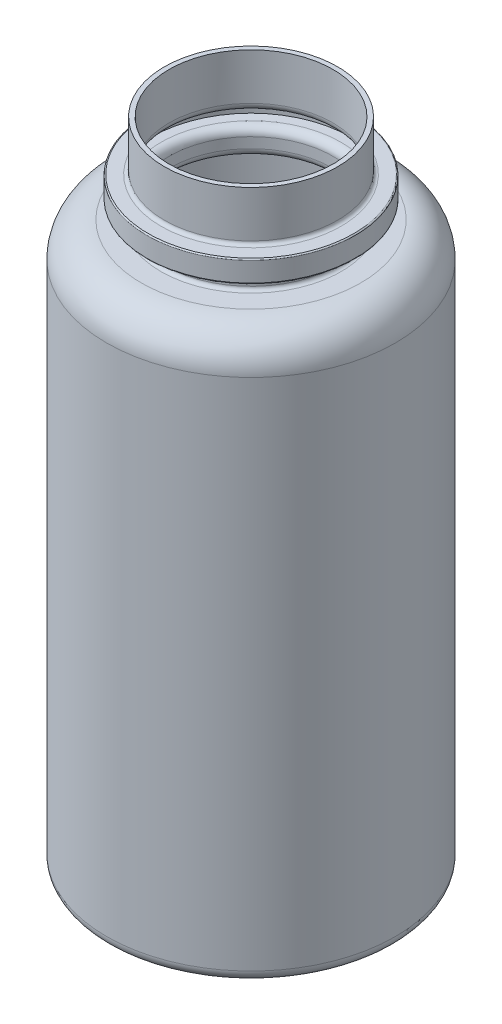
ISO-10303-21;
HEADER;
FILE_DESCRIPTION(('STEP AP214'),'2;1');
FILE_NAME('part.step','',(''),(''),'','','');
FILE_SCHEMA(('AUTOMOTIVE_DESIGN { 1 0 10303 214 1 1 1 1 }'));
ENDSEC;
DATA;
#1=APPLICATION_CONTEXT('core data for automotive mechanical design processes');
#2=APPLICATION_PROTOCOL_DEFINITION('international standard','automotive_design',2000,#1);
#3=PRODUCT_CONTEXT('',#1,'mechanical');
#4=PRODUCT('Part','Part','',(#3));
#5=PRODUCT_RELATED_PRODUCT_CATEGORY('part','',(#4));
#6=PRODUCT_DEFINITION_FORMATION('','',#4);
#7=PRODUCT_DEFINITION_CONTEXT('part definition',#1,'design');
#8=PRODUCT_DEFINITION('design','',#6,#7);
#9=PRODUCT_DEFINITION_SHAPE('','',#8);
#10=(LENGTH_UNIT() NAMED_UNIT(*) SI_UNIT(.MILLI.,.METRE.));
#11=(NAMED_UNIT(*) PLANE_ANGLE_UNIT() SI_UNIT($,.RADIAN.));
#12=(NAMED_UNIT(*) SI_UNIT($,.STERADIAN.) SOLID_ANGLE_UNIT());
#13=UNCERTAINTY_MEASURE_WITH_UNIT(LENGTH_MEASURE(1.E-05),#10,'distance_accuracy_value','');
#14=(GEOMETRIC_REPRESENTATION_CONTEXT(3) GLOBAL_UNCERTAINTY_ASSIGNED_CONTEXT((#13)) GLOBAL_UNIT_ASSIGNED_CONTEXT((#10,
#11,#12)) REPRESENTATION_CONTEXT('',''));
#15=CARTESIAN_POINT('',(0.,0.,0.));
#16=DIRECTION('',(0.,0.,1.));
#17=DIRECTION('',(1.,0.,0.));
#18=AXIS2_PLACEMENT_3D('',#15,#16,#17);
#19=CARTESIAN_POINT('',(0.,56.2132000943814,0.));
#20=DIRECTION('',(0.,-1.,0.));
#21=DIRECTION('',(0.,0.,-1.));
#22=AXIS2_PLACEMENT_3D('',#19,#20,#21);
#23=PLANE('',#22);
#24=CARTESIAN_POINT('',(0.,56.2132000943814,0.));
#25=DIRECTION('',(0.,1.,0.));
#26=DIRECTION('',(0.,0.,1.));
#27=AXIS2_PLACEMENT_3D('',#24,#25,#26);
#28=CIRCLE('',#27,7.1);
#29=CARTESIAN_POINT('',(0.,56.2132000943814,7.1));
#30=VERTEX_POINT('',#29);
#31=EDGE_CURVE('E69',#30,#30,#28,.T.);
#32=ORIENTED_EDGE('',*,*,#31,.F.);
#33=EDGE_LOOP('',(#32));
#34=FACE_BOUND('',#33,.T.);
#35=CARTESIAN_POINT('',(0.,56.2132000943814,0.));
#36=DIRECTION('',(0.,1.,0.));
#37=DIRECTION('',(0.,0.,1.));
#38=AXIS2_PLACEMENT_3D('',#35,#36,#37);
#39=CIRCLE('',#38,7.5);
#40=CARTESIAN_POINT('',(0.,56.2132000943814,7.5));
#41=VERTEX_POINT('',#40);
#42=EDGE_CURVE('E75',#41,#41,#39,.T.);
#43=ORIENTED_EDGE('',*,*,#42,.T.);
#44=EDGE_LOOP('',(#43));
#45=FACE_BOUND('',#44,.T.);
#46=ADVANCED_FACE('F41',(#34,#45),#23,.F.);
#47=CARTESIAN_POINT('',(0.,1.4,0.));
#48=DIRECTION('',(0.,1.,0.));
#49=DIRECTION('',(0.,0.,1.));
#50=AXIS2_PLACEMENT_3D('',#47,#48,#49);
#51=PLANE('',#50);
#52=CARTESIAN_POINT('',(0.,1.4,0.));
#53=DIRECTION('',(0.,1.,0.));
#54=DIRECTION('',(0.,0.,1.));
#55=AXIS2_PLACEMENT_3D('',#52,#53,#54);
#56=CIRCLE('',#55,8.);
#57=CARTESIAN_POINT('',(0.,1.4,8.));
#58=VERTEX_POINT('',#57);
#59=EDGE_CURVE('E154',#58,#58,#56,.T.);
#60=ORIENTED_EDGE('',*,*,#59,.T.);
#61=EDGE_LOOP('',(#60));
#62=FACE_BOUND('',#61,.T.);
#63=ADVANCED_FACE('F231',(#62),#51,.T.);
#64=CARTESIAN_POINT('',(8.5,0.4,0.));
#65=DIRECTION('',(0.,1.,0.));
#66=DIRECTION('',(0.,0.,1.));
#67=AXIS2_PLACEMENT_3D('',#64,#65,#66);
#68=PLANE('',#67);
#69=CARTESIAN_POINT('',(0.,0.4,0.));
#70=DIRECTION('',(0.,1.,0.));
#71=DIRECTION('',(0.,0.,1.));
#72=AXIS2_PLACEMENT_3D('',#69,#70,#71);
#73=CIRCLE('',#72,9.);
#74=CARTESIAN_POINT('',(0.,0.4,9.));
#75=VERTEX_POINT('',#74);
#76=EDGE_CURVE('E64',#75,#75,#73,.F.);
#77=ORIENTED_EDGE('',*,*,#76,.T.);
#78=EDGE_LOOP('',(#77));
#79=FACE_BOUND('',#78,.T.);
#80=CARTESIAN_POINT('',(0.,0.4,0.));
#81=DIRECTION('',(0.,1.,0.));
#82=DIRECTION('',(0.,0.,1.));
#83=AXIS2_PLACEMENT_3D('',#80,#81,#82);
#84=CIRCLE('',#83,11.5);
#85=CARTESIAN_POINT('',(0.,0.4,11.5));
#86=VERTEX_POINT('',#85);
#87=EDGE_CURVE('E158',#86,#86,#84,.T.);
#88=ORIENTED_EDGE('',*,*,#87,.T.);
#89=EDGE_LOOP('',(#88));
#90=FACE_BOUND('',#89,.T.);
#91=ADVANCED_FACE('F225',(#79,#90),#68,.T.);
#92=CARTESIAN_POINT('',(0.,0.,0.));
#93=DIRECTION('',(0.,1.,0.));
#94=DIRECTION('',(0.,0.,1.));
#95=AXIS2_PLACEMENT_3D('',#92,#93,#94);
#96=CYLINDRICAL_SURFACE('',#95,12.1);
#97=CARTESIAN_POINT('',(0.,1.,0.));
#98=DIRECTION('',(0.,1.,0.));
#99=DIRECTION('',(0.,0.,1.));
#100=AXIS2_PLACEMENT_3D('',#97,#98,#99);
#101=CIRCLE('',#100,12.1);
#102=CARTESIAN_POINT('',(0.,1.,12.1));
#103=VERTEX_POINT('',#102);
#104=EDGE_CURVE('E162',#103,#103,#101,.F.);
#105=ORIENTED_EDGE('',*,*,#104,.T.);
#106=EDGE_LOOP('',(#105));
#107=FACE_BOUND('',#106,.T.);
#108=CARTESIAN_POINT('',(0.,45.5,0.));
#109=DIRECTION('',(0.,1.,0.));
#110=DIRECTION('',(0.,0.,1.));
#111=AXIS2_PLACEMENT_3D('',#108,#109,#110);
#112=CIRCLE('',#111,12.1);
#113=CARTESIAN_POINT('',(0.,45.5,12.1));
#114=VERTEX_POINT('',#113);
#115=EDGE_CURVE('E73',#114,#114,#112,.T.);
#116=ORIENTED_EDGE('',*,*,#115,.T.);
#117=EDGE_LOOP('',(#116));
#118=FACE_BOUND('',#117,.T.);
#119=ADVANCED_FACE('F212',(#107,#118),#96,.F.);
#120=CARTESIAN_POINT('',(12.5,48.1,0.));
#121=DIRECTION('',(0.,-1.,0.));
#122=DIRECTION('',(0.,0.,-1.));
#123=AXIS2_PLACEMENT_3D('',#120,#121,#122);
#124=PLANE('',#123);
#125=CARTESIAN_POINT('',(0.,48.1,0.));
#126=DIRECTION('',(0.,-1.,0.));
#127=DIRECTION('',(0.,0.,-1.));
#128=AXIS2_PLACEMENT_3D('',#125,#126,#127);
#129=CIRCLE('',#128,7.8);
#130=CARTESIAN_POINT('',(0.,48.1,-7.8));
#131=VERTEX_POINT('',#130);
#132=EDGE_CURVE('E55',#131,#131,#129,.F.);
#133=ORIENTED_EDGE('',*,*,#132,.T.);
#134=EDGE_LOOP('',(#133));
#135=FACE_BOUND('',#134,.T.);
#136=CARTESIAN_POINT('',(0.,48.1,0.));
#137=DIRECTION('',(0.,-1.,0.));
#138=DIRECTION('',(0.,0.,-1.));
#139=AXIS2_PLACEMENT_3D('',#136,#137,#138);
#140=CIRCLE('',#139,9.5);
#141=CARTESIAN_POINT('',(0.,48.1,-9.5));
#142=VERTEX_POINT('',#141);
#143=EDGE_CURVE('E163',#142,#142,#140,.T.);
#144=ORIENTED_EDGE('',*,*,#143,.T.);
#145=EDGE_LOOP('',(#144));
#146=FACE_BOUND('',#145,.T.);
#147=ADVANCED_FACE('F200',(#135,#146),#124,.T.);
#148=CARTESIAN_POINT('',(0.,0.,0.));
#149=DIRECTION('',(0.,1.,0.));
#150=DIRECTION('',(0.,0.,1.));
#151=AXIS2_PLACEMENT_3D('',#148,#149,#150);
#152=CYLINDRICAL_SURFACE('',#151,7.1);
#153=CARTESIAN_POINT('',(0.,49.7,0.));
#154=DIRECTION('',(0.,1.,0.));
#155=DIRECTION('',(0.,0.,1.));
#156=AXIS2_PLACEMENT_3D('',#153,#154,#155);
#157=CIRCLE('',#156,7.1);
#158=CARTESIAN_POINT('',(0.,49.7,7.1));
#159=VERTEX_POINT('',#158);
#160=EDGE_CURVE('E180',#159,#159,#157,.T.);
#161=ORIENTED_EDGE('',*,*,#160,.T.);
#162=EDGE_LOOP('',(#161));
#163=FACE_BOUND('',#162,.T.);
#164=CARTESIAN_POINT('',(0.,48.8,0.));
#165=DIRECTION('',(0.,1.,0.));
#166=DIRECTION('',(0.,0.,1.));
#167=AXIS2_PLACEMENT_3D('',#164,#165,#166);
#168=CIRCLE('',#167,7.1);
#169=CARTESIAN_POINT('',(0.,48.8,7.1));
#170=VERTEX_POINT('',#169);
#171=EDGE_CURVE('E68',#170,#170,#168,.F.);
#172=ORIENTED_EDGE('',*,*,#171,.T.);
#173=EDGE_LOOP('',(#172));
#174=FACE_BOUND('',#173,.T.);
#175=ADVANCED_FACE('F197',(#163,#174),#152,.F.);
#176=CARTESIAN_POINT('',(7.5,50.4,0.));
#177=DIRECTION('',(0.,1.,0.));
#178=DIRECTION('',(0.,0.,1.));
#179=AXIS2_PLACEMENT_3D('',#176,#177,#178);
#180=PLANE('',#179);
#181=CARTESIAN_POINT('',(0.,50.4,0.));
#182=DIRECTION('',(0.,1.,0.));
#183=DIRECTION('',(0.,0.,1.));
#184=AXIS2_PLACEMENT_3D('',#181,#182,#183);
#185=CIRCLE('',#184,8.6);
#186=CARTESIAN_POINT('',(0.,50.4,8.6));
#187=VERTEX_POINT('',#186);
#188=EDGE_CURVE('E49',#187,#187,#185,.T.);
#189=ORIENTED_EDGE('',*,*,#188,.T.);
#190=EDGE_LOOP('',(#189));
#191=FACE_BOUND('',#190,.T.);
#192=CARTESIAN_POINT('',(0.,50.4,0.));
#193=DIRECTION('',(0.,1.,0.));
#194=DIRECTION('',(0.,0.,1.));
#195=AXIS2_PLACEMENT_3D('',#192,#193,#194);
#196=CIRCLE('',#195,7.8);
#197=CARTESIAN_POINT('',(0.,50.4,7.8));
#198=VERTEX_POINT('',#197);
#199=EDGE_CURVE('E176',#198,#198,#196,.F.);
#200=ORIENTED_EDGE('',*,*,#199,.T.);
#201=EDGE_LOOP('',(#200));
#202=FACE_BOUND('',#201,.T.);
#203=ADVANCED_FACE('F187',(#191,#202),#180,.T.);
#204=CARTESIAN_POINT('',(0.,0.,0.));
#205=DIRECTION('',(0.,1.,0.));
#206=DIRECTION('',(0.,0.,1.));
#207=AXIS2_PLACEMENT_3D('',#204,#205,#206);
#208=CYLINDRICAL_SURFACE('',#207,8.6);
#209=ORIENTED_EDGE('',*,*,#188,.F.);
#210=EDGE_LOOP('',(#209));
#211=FACE_BOUND('',#210,.T.);
#212=CARTESIAN_POINT('',(0.,51.5,0.));
#213=DIRECTION('',(0.,-1.,0.));
#214=DIRECTION('',(0.,0.,-1.));
#215=AXIS2_PLACEMENT_3D('',#212,#213,#214);
#216=CIRCLE('',#215,8.6);
#217=CARTESIAN_POINT('',(0.,51.5,-8.6));
#218=VERTEX_POINT('',#217);
#219=EDGE_CURVE('E10',#218,#218,#216,.F.);
#220=ORIENTED_EDGE('',*,*,#219,.T.);
#221=EDGE_LOOP('',(#220));
#222=FACE_BOUND('',#221,.T.);
#223=ADVANCED_FACE('F480',(#211,#222),#208,.F.);
#224=CARTESIAN_POINT('',(9.,51.5,0.));
#225=DIRECTION('',(0.,-1.,0.));
#226=DIRECTION('',(0.,0.,-1.));
#227=AXIS2_PLACEMENT_3D('',#224,#225,#226);
#228=PLANE('',#227);
#229=ORIENTED_EDGE('',*,*,#219,.F.);
#230=EDGE_LOOP('',(#229));
#231=FACE_BOUND('',#230,.T.);
#232=CARTESIAN_POINT('',(0.,51.5,0.));
#233=DIRECTION('',(0.,-1.,0.));
#234=DIRECTION('',(0.,0.,-1.));
#235=AXIS2_PLACEMENT_3D('',#232,#233,#234);
#236=CIRCLE('',#235,7.8);
#237=CARTESIAN_POINT('',(0.,51.5,-7.8));
#238=VERTEX_POINT('',#237);
#239=EDGE_CURVE('E59',#238,#238,#236,.F.);
#240=ORIENTED_EDGE('',*,*,#239,.T.);
#241=EDGE_LOOP('',(#240));
#242=FACE_BOUND('',#241,.T.);
#243=ADVANCED_FACE('F471',(#231,#242),#228,.T.);
#244=CARTESIAN_POINT('',(0.,0.,0.));
#245=DIRECTION('',(0.,1.,0.));
#246=DIRECTION('',(0.,0.,1.));
#247=AXIS2_PLACEMENT_3D('',#244,#245,#246);
#248=CYLINDRICAL_SURFACE('',#247,7.1);
#249=CARTESIAN_POINT('',(0.,52.2,0.));
#250=DIRECTION('',(0.,1.,0.));
#251=DIRECTION('',(0.,0.,1.));
#252=AXIS2_PLACEMENT_3D('',#249,#250,#251);
#253=CIRCLE('',#252,7.1);
#254=CARTESIAN_POINT('',(0.,52.2,7.1));
#255=VERTEX_POINT('',#254);
#256=EDGE_CURVE('E63',#255,#255,#253,.F.);
#257=ORIENTED_EDGE('',*,*,#256,.T.);
#258=EDGE_LOOP('',(#257));
#259=FACE_BOUND('',#258,.T.);
#260=ORIENTED_EDGE('',*,*,#31,.T.);
#261=EDGE_LOOP('',(#260));
#262=FACE_BOUND('',#261,.T.);
#263=ADVANCED_FACE('F220',(#259,#262),#248,.F.);
#264=CARTESIAN_POINT('',(0.,45.5,0.));
#265=DIRECTION('',(0.,-1.,0.));
#266=DIRECTION('',(0.,0.,-1.));
#267=AXIS2_PLACEMENT_3D('',#264,#265,#266);
#268=TOROIDAL_SURFACE('',#267,9.5,2.6);
#269=ORIENTED_EDGE('',*,*,#143,.F.);
#270=EDGE_LOOP('',(#269));
#271=FACE_BOUND('',#270,.T.);
#272=ORIENTED_EDGE('',*,*,#115,.F.);
#273=EDGE_LOOP('',(#272));
#274=FACE_BOUND('',#273,.T.);
#275=ADVANCED_FACE('F216',(#271,#274),#268,.F.);
#276=CARTESIAN_POINT('',(0.,1.,0.));
#277=DIRECTION('',(0.,1.,0.));
#278=DIRECTION('',(0.,0.,1.));
#279=AXIS2_PLACEMENT_3D('',#276,#277,#278);
#280=TOROIDAL_SURFACE('',#279,11.5,0.6);
#281=ORIENTED_EDGE('',*,*,#104,.F.);
#282=EDGE_LOOP('',(#281));
#283=FACE_BOUND('',#282,.T.);
#284=ORIENTED_EDGE('',*,*,#87,.F.);
#285=EDGE_LOOP('',(#284));
#286=FACE_BOUND('',#285,.T.);
#287=ADVANCED_FACE('F219',(#283,#286),#280,.F.);
#288=CARTESIAN_POINT('',(0.,0.5,0.));
#289=DIRECTION('',(0.,1.,0.));
#290=DIRECTION('',(0.,0.,1.));
#291=AXIS2_PLACEMENT_3D('',#288,#289,#290);
#292=TOROIDAL_SURFACE('',#291,9.,0.1);
#293=ORIENTED_EDGE('',*,*,#76,.F.);
#294=EDGE_LOOP('',(#293));
#295=FACE_BOUND('',#294,.T.);
#296=CARTESIAN_POINT('',(0.,0.5,0.));
#297=DIRECTION('',(0.,1.,0.));
#298=DIRECTION('',(0.,0.,1.));
#299=AXIS2_PLACEMENT_3D('',#296,#297,#298);
#300=CIRCLE('',#299,8.9);
#301=CARTESIAN_POINT('',(0.,0.5,8.9));
#302=VERTEX_POINT('',#301);
#303=EDGE_CURVE('E74',#302,#302,#300,.T.);
#304=ORIENTED_EDGE('',*,*,#303,.F.);
#305=EDGE_LOOP('',(#304));
#306=FACE_BOUND('',#305,.T.);
#307=ADVANCED_FACE('F438',(#295,#306),#292,.F.);
#308=CARTESIAN_POINT('',(0.,0.5,0.));
#309=DIRECTION('',(0.,1.,0.));
#310=DIRECTION('',(0.,0.,1.));
#311=AXIS2_PLACEMENT_3D('',#308,#309,#310);
#312=TOROIDAL_SURFACE('',#311,8.,0.9);
#313=ORIENTED_EDGE('',*,*,#303,.T.);
#314=EDGE_LOOP('',(#313));
#315=FACE_BOUND('',#314,.T.);
#316=ORIENTED_EDGE('',*,*,#59,.F.);
#317=EDGE_LOOP('',(#316));
#318=FACE_BOUND('',#317,.T.);
#319=ADVANCED_FACE('F428',(#315,#318),#312,.T.);
#320=CARTESIAN_POINT('',(0.,52.2,0.));
#321=DIRECTION('',(0.,-1.,0.));
#322=DIRECTION('',(0.,0.,-1.));
#323=AXIS2_PLACEMENT_3D('',#320,#321,#322);
#324=TOROIDAL_SURFACE('',#323,7.8,0.7);
#325=ORIENTED_EDGE('',*,*,#256,.F.);
#326=EDGE_LOOP('',(#325));
#327=FACE_BOUND('',#326,.T.);
#328=ORIENTED_EDGE('',*,*,#239,.F.);
#329=EDGE_LOOP('',(#328));
#330=FACE_BOUND('',#329,.T.);
#331=ADVANCED_FACE('F193',(#327,#330),#324,.T.);
#332=CARTESIAN_POINT('',(0.,49.7,0.));
#333=DIRECTION('',(0.,1.,0.));
#334=DIRECTION('',(0.,0.,1.));
#335=AXIS2_PLACEMENT_3D('',#332,#333,#334);
#336=TOROIDAL_SURFACE('',#335,7.8,0.7);
#337=ORIENTED_EDGE('',*,*,#199,.F.);
#338=EDGE_LOOP('',(#337));
#339=FACE_BOUND('',#338,.T.);
#340=ORIENTED_EDGE('',*,*,#160,.F.);
#341=EDGE_LOOP('',(#340));
#342=FACE_BOUND('',#341,.T.);
#343=ADVANCED_FACE('F189',(#339,#342),#336,.T.);
#344=CARTESIAN_POINT('',(0.,48.8,0.));
#345=DIRECTION('',(0.,-1.,0.));
#346=DIRECTION('',(0.,0.,-1.));
#347=AXIS2_PLACEMENT_3D('',#344,#345,#346);
#348=TOROIDAL_SURFACE('',#347,7.8,0.7);
#349=ORIENTED_EDGE('',*,*,#171,.F.);
#350=EDGE_LOOP('',(#349));
#351=FACE_BOUND('',#350,.T.);
#352=ORIENTED_EDGE('',*,*,#132,.F.);
#353=EDGE_LOOP('',(#352));
#354=FACE_BOUND('',#353,.T.);
#355=ADVANCED_FACE('F192',(#351,#354),#348,.T.);
#356=CARTESIAN_POINT('',(0.,1.,0.));
#357=DIRECTION('',(0.,1.,0.));
#358=DIRECTION('',(0.,0.,1.));
#359=AXIS2_PLACEMENT_3D('',#356,#357,#358);
#360=PLANE('',#359);
#361=CARTESIAN_POINT('',(0.,1.,0.));
#362=DIRECTION('',(0.,1.,0.));
#363=DIRECTION('',(0.,0.,1.));
#364=AXIS2_PLACEMENT_3D('',#361,#362,#363);
#365=CIRCLE('',#364,8.);
#366=CARTESIAN_POINT('',(0.,1.,8.));
#367=VERTEX_POINT('',#366);
#368=EDGE_CURVE('E96',#367,#367,#365,.T.);
#369=ORIENTED_EDGE('',*,*,#368,.F.);
#370=EDGE_LOOP('',(#369));
#371=FACE_BOUND('',#370,.T.);
#372=ADVANCED_FACE('F206',(#371),#360,.F.);
#373=CARTESIAN_POINT('',(8.5,0.,0.));
#374=DIRECTION('',(0.,1.,0.));
#375=DIRECTION('',(0.,0.,1.));
#376=AXIS2_PLACEMENT_3D('',#373,#374,#375);
#377=PLANE('',#376);
#378=CARTESIAN_POINT('',(0.,0.,0.));
#379=DIRECTION('',(0.,1.,0.));
#380=DIRECTION('',(0.,0.,1.));
#381=AXIS2_PLACEMENT_3D('',#378,#379,#380);
#382=CIRCLE('',#381,9.);
#383=CARTESIAN_POINT('',(0.,0.,9.));
#384=VERTEX_POINT('',#383);
#385=EDGE_CURVE('E100',#384,#384,#382,.F.);
#386=ORIENTED_EDGE('',*,*,#385,.F.);
#387=EDGE_LOOP('',(#386));
#388=FACE_BOUND('',#387,.T.);
#389=CARTESIAN_POINT('',(0.,0.,0.));
#390=DIRECTION('',(0.,1.,0.));
#391=DIRECTION('',(0.,0.,1.));
#392=AXIS2_PLACEMENT_3D('',#389,#390,#391);
#393=CIRCLE('',#392,11.5);
#394=CARTESIAN_POINT('',(0.,0.,11.5));
#395=VERTEX_POINT('',#394);
#396=EDGE_CURVE('E88',#395,#395,#393,.T.);
#397=ORIENTED_EDGE('',*,*,#396,.F.);
#398=EDGE_LOOP('',(#397));
#399=FACE_BOUND('',#398,.T.);
#400=ADVANCED_FACE('F281',(#388,#399),#377,.F.);
#401=CARTESIAN_POINT('',(0.,0.,0.));
#402=DIRECTION('',(0.,1.,0.));
#403=DIRECTION('',(0.,0.,1.));
#404=AXIS2_PLACEMENT_3D('',#401,#402,#403);
#405=CYLINDRICAL_SURFACE('',#404,12.5);
#406=CARTESIAN_POINT('',(0.,1.,0.));
#407=DIRECTION('',(0.,1.,0.));
#408=DIRECTION('',(0.,0.,1.));
#409=AXIS2_PLACEMENT_3D('',#406,#407,#408);
#410=CIRCLE('',#409,12.5);
#411=CARTESIAN_POINT('',(0.,1.,12.5));
#412=VERTEX_POINT('',#411);
#413=EDGE_CURVE('E92',#412,#412,#410,.F.);
#414=ORIENTED_EDGE('',*,*,#413,.F.);
#415=EDGE_LOOP('',(#414));
#416=FACE_BOUND('',#415,.T.);
#417=CARTESIAN_POINT('',(0.,45.5,0.));
#418=DIRECTION('',(0.,-1.,0.));
#419=DIRECTION('',(0.,0.,-1.));
#420=AXIS2_PLACEMENT_3D('',#417,#418,#419);
#421=CIRCLE('',#420,12.5);
#422=CARTESIAN_POINT('',(0.,45.5,-12.5));
#423=VERTEX_POINT('',#422);
#424=EDGE_CURVE('E79',#423,#423,#421,.F.);
#425=ORIENTED_EDGE('',*,*,#424,.F.);
#426=EDGE_LOOP('',(#425));
#427=FACE_BOUND('',#426,.T.);
#428=ADVANCED_FACE('F277',(#416,#427),#405,.T.);
#429=CARTESIAN_POINT('',(12.5,48.5,0.));
#430=DIRECTION('',(0.,-1.,0.));
#431=DIRECTION('',(0.,0.,-1.));
#432=AXIS2_PLACEMENT_3D('',#429,#430,#431);
#433=PLANE('',#432);
#434=CARTESIAN_POINT('',(0.,48.5,0.));
#435=DIRECTION('',(0.,-1.,0.));
#436=DIRECTION('',(0.,0.,-1.));
#437=AXIS2_PLACEMENT_3D('',#434,#435,#436);
#438=CIRCLE('',#437,7.8);
#439=CARTESIAN_POINT('',(0.,48.5,-7.8));
#440=VERTEX_POINT('',#439);
#441=EDGE_CURVE('E127',#440,#440,#438,.F.);
#442=ORIENTED_EDGE('',*,*,#441,.F.);
#443=EDGE_LOOP('',(#442));
#444=FACE_BOUND('',#443,.T.);
#445=CARTESIAN_POINT('',(0.,48.5,0.));
#446=DIRECTION('',(0.,-1.,0.));
#447=DIRECTION('',(0.,0.,-1.));
#448=AXIS2_PLACEMENT_3D('',#445,#446,#447);
#449=CIRCLE('',#448,9.5);
#450=CARTESIAN_POINT('',(0.,48.5,-9.5));
#451=VERTEX_POINT('',#450);
#452=EDGE_CURVE('E84',#451,#451,#449,.T.);
#453=ORIENTED_EDGE('',*,*,#452,.F.);
#454=EDGE_LOOP('',(#453));
#455=FACE_BOUND('',#454,.T.);
#456=ADVANCED_FACE('F273',(#444,#455),#433,.F.);
#457=CARTESIAN_POINT('',(0.,0.,0.));
#458=DIRECTION('',(0.,1.,0.));
#459=DIRECTION('',(0.,0.,1.));
#460=AXIS2_PLACEMENT_3D('',#457,#458,#459);
#461=CYLINDRICAL_SURFACE('',#460,7.5);
#462=CARTESIAN_POINT('',(0.,49.7,0.));
#463=DIRECTION('',(0.,1.,0.));
#464=DIRECTION('',(0.,0.,1.));
#465=AXIS2_PLACEMENT_3D('',#462,#463,#464);
#466=CIRCLE('',#465,7.5);
#467=CARTESIAN_POINT('',(0.,49.7,7.5));
#468=VERTEX_POINT('',#467);
#469=EDGE_CURVE('E119',#468,#468,#466,.T.);
#470=ORIENTED_EDGE('',*,*,#469,.F.);
#471=EDGE_LOOP('',(#470));
#472=FACE_BOUND('',#471,.T.);
#473=CARTESIAN_POINT('',(0.,48.8,0.));
#474=DIRECTION('',(0.,-1.,0.));
#475=DIRECTION('',(0.,0.,-1.));
#476=AXIS2_PLACEMENT_3D('',#473,#474,#475);
#477=CIRCLE('',#476,7.5);
#478=CARTESIAN_POINT('',(0.,48.8,-7.5));
#479=VERTEX_POINT('',#478);
#480=EDGE_CURVE('E115',#479,#479,#477,.T.);
#481=ORIENTED_EDGE('',*,*,#480,.F.);
#482=EDGE_LOOP('',(#481));
#483=FACE_BOUND('',#482,.T.);
#484=ADVANCED_FACE('F269',(#472,#483),#461,.T.);
#485=CARTESIAN_POINT('',(7.5,50.,0.));
#486=DIRECTION('',(0.,1.,0.));
#487=DIRECTION('',(0.,0.,1.));
#488=AXIS2_PLACEMENT_3D('',#485,#486,#487);
#489=PLANE('',#488);
#490=CARTESIAN_POINT('',(0.,50.,0.));
#491=DIRECTION('',(0.,1.,0.));
#492=DIRECTION('',(0.,0.,1.));
#493=AXIS2_PLACEMENT_3D('',#490,#491,#492);
#494=CIRCLE('',#493,8.9);
#495=CARTESIAN_POINT('',(0.,50.,8.9));
#496=VERTEX_POINT('',#495);
#497=EDGE_CURVE('E131',#496,#496,#494,.T.);
#498=ORIENTED_EDGE('',*,*,#497,.F.);
#499=EDGE_LOOP('',(#498));
#500=FACE_BOUND('',#499,.T.);
#501=CARTESIAN_POINT('',(0.,50.,0.));
#502=DIRECTION('',(0.,1.,0.));
#503=DIRECTION('',(0.,0.,1.));
#504=AXIS2_PLACEMENT_3D('',#501,#502,#503);
#505=CIRCLE('',#504,7.8);
#506=CARTESIAN_POINT('',(0.,50.,7.8));
#507=VERTEX_POINT('',#506);
#508=EDGE_CURVE('E123',#507,#507,#505,.F.);
#509=ORIENTED_EDGE('',*,*,#508,.F.);
#510=EDGE_LOOP('',(#509));
#511=FACE_BOUND('',#510,.T.);
#512=ADVANCED_FACE('F265',(#500,#511),#489,.F.);
#513=CARTESIAN_POINT('',(0.,0.,0.));
#514=DIRECTION('',(0.,1.,0.));
#515=DIRECTION('',(0.,0.,1.));
#516=AXIS2_PLACEMENT_3D('',#513,#514,#515);
#517=CYLINDRICAL_SURFACE('',#516,9.);
#518=CARTESIAN_POINT('',(0.,50.1,0.));
#519=DIRECTION('',(0.,1.,0.));
#520=DIRECTION('',(0.,0.,1.));
#521=AXIS2_PLACEMENT_3D('',#518,#519,#520);
#522=CIRCLE('',#521,9.);
#523=CARTESIAN_POINT('',(0.,50.1,9.));
#524=VERTEX_POINT('',#523);
#525=EDGE_CURVE('E138',#524,#524,#522,.F.);
#526=ORIENTED_EDGE('',*,*,#525,.F.);
#527=EDGE_LOOP('',(#526));
#528=FACE_BOUND('',#527,.T.);
#529=CARTESIAN_POINT('',(0.,51.8,0.));
#530=DIRECTION('',(0.,-1.,0.));
#531=DIRECTION('',(0.,0.,-1.));
#532=AXIS2_PLACEMENT_3D('',#529,#530,#531);
#533=CIRCLE('',#532,9.);
#534=CARTESIAN_POINT('',(0.,51.8,-9.));
#535=VERTEX_POINT('',#534);
#536=EDGE_CURVE('E135',#535,#535,#533,.F.);
#537=ORIENTED_EDGE('',*,*,#536,.F.);
#538=EDGE_LOOP('',(#537));
#539=FACE_BOUND('',#538,.T.);
#540=ADVANCED_FACE('F258',(#528,#539),#517,.T.);
#541=CARTESIAN_POINT('',(9.,51.9,0.));
#542=DIRECTION('',(0.,-1.,0.));
#543=DIRECTION('',(0.,0.,-1.));
#544=AXIS2_PLACEMENT_3D('',#541,#542,#543);
#545=PLANE('',#544);
#546=CARTESIAN_POINT('',(0.,51.9,0.));
#547=DIRECTION('',(0.,-1.,0.));
#548=DIRECTION('',(0.,0.,-1.));
#549=AXIS2_PLACEMENT_3D('',#546,#547,#548);
#550=CIRCLE('',#549,8.9);
#551=CARTESIAN_POINT('',(0.,51.9,-8.9));
#552=VERTEX_POINT('',#551);
#553=EDGE_CURVE('E44',#552,#552,#550,.T.);
#554=ORIENTED_EDGE('',*,*,#553,.F.);
#555=EDGE_LOOP('',(#554));
#556=FACE_BOUND('',#555,.T.);
#557=CARTESIAN_POINT('',(0.,51.9,0.));
#558=DIRECTION('',(0.,-1.,0.));
#559=DIRECTION('',(0.,0.,-1.));
#560=AXIS2_PLACEMENT_3D('',#557,#558,#559);
#561=CIRCLE('',#560,7.8);
#562=CARTESIAN_POINT('',(0.,51.9,-7.8));
#563=VERTEX_POINT('',#562);
#564=EDGE_CURVE('E104',#563,#563,#561,.F.);
#565=ORIENTED_EDGE('',*,*,#564,.F.);
#566=EDGE_LOOP('',(#565));
#567=FACE_BOUND('',#566,.T.);
#568=ADVANCED_FACE('F248',(#556,#567),#545,.F.);
#569=CARTESIAN_POINT('',(0.,0.,0.));
#570=DIRECTION('',(0.,1.,0.));
#571=DIRECTION('',(0.,0.,1.));
#572=AXIS2_PLACEMENT_3D('',#569,#570,#571);
#573=CYLINDRICAL_SURFACE('',#572,7.5);
#574=CARTESIAN_POINT('',(0.,52.2,0.));
#575=DIRECTION('',(0.,-1.,0.));
#576=DIRECTION('',(0.,0.,-1.));
#577=AXIS2_PLACEMENT_3D('',#574,#575,#576);
#578=CIRCLE('',#577,7.5);
#579=CARTESIAN_POINT('',(0.,52.2,-7.5));
#580=VERTEX_POINT('',#579);
#581=EDGE_CURVE('E111',#580,#580,#578,.T.);
#582=ORIENTED_EDGE('',*,*,#581,.F.);
#583=EDGE_LOOP('',(#582));
#584=FACE_BOUND('',#583,.T.);
#585=ORIENTED_EDGE('',*,*,#42,.F.);
#586=EDGE_LOOP('',(#585));
#587=FACE_BOUND('',#586,.T.);
#588=ADVANCED_FACE('F245',(#584,#587),#573,.T.);
#589=CARTESIAN_POINT('',(0.,45.5,0.));
#590=DIRECTION('',(0.,-1.,0.));
#591=DIRECTION('',(0.,0.,-1.));
#592=AXIS2_PLACEMENT_3D('',#589,#590,#591);
#593=TOROIDAL_SURFACE('',#592,9.5,3.);
#594=ORIENTED_EDGE('',*,*,#452,.T.);
#595=EDGE_LOOP('',(#594));
#596=FACE_BOUND('',#595,.T.);
#597=ORIENTED_EDGE('',*,*,#424,.T.);
#598=EDGE_LOOP('',(#597));
#599=FACE_BOUND('',#598,.T.);
#600=ADVANCED_FACE('F247',(#596,#599),#593,.T.);
#601=CARTESIAN_POINT('',(0.,1.,0.));
#602=DIRECTION('',(0.,1.,0.));
#603=DIRECTION('',(0.,0.,1.));
#604=AXIS2_PLACEMENT_3D('',#601,#602,#603);
#605=TOROIDAL_SURFACE('',#604,11.5,1.);
#606=ORIENTED_EDGE('',*,*,#413,.T.);
#607=EDGE_LOOP('',(#606));
#608=FACE_BOUND('',#607,.T.);
#609=ORIENTED_EDGE('',*,*,#396,.T.);
#610=EDGE_LOOP('',(#609));
#611=FACE_BOUND('',#610,.T.);
#612=ADVANCED_FACE('F255',(#608,#611),#605,.T.);
#613=CARTESIAN_POINT('',(0.,0.5,0.));
#614=DIRECTION('',(0.,1.,0.));
#615=DIRECTION('',(0.,0.,1.));
#616=AXIS2_PLACEMENT_3D('',#613,#614,#615);
#617=TOROIDAL_SURFACE('',#616,9.,0.5);
#618=ORIENTED_EDGE('',*,*,#385,.T.);
#619=EDGE_LOOP('',(#618));
#620=FACE_BOUND('',#619,.T.);
#621=CARTESIAN_POINT('',(0.,0.5,0.));
#622=DIRECTION('',(0.,1.,0.));
#623=DIRECTION('',(0.,0.,1.));
#624=AXIS2_PLACEMENT_3D('',#621,#622,#623);
#625=CIRCLE('',#624,8.5);
#626=CARTESIAN_POINT('',(0.,0.5,8.5));
#627=VERTEX_POINT('',#626);
#628=EDGE_CURVE('E80',#627,#627,#625,.T.);
#629=ORIENTED_EDGE('',*,*,#628,.T.);
#630=EDGE_LOOP('',(#629));
#631=FACE_BOUND('',#630,.T.);
#632=ADVANCED_FACE('F291',(#620,#631),#617,.T.);
#633=CARTESIAN_POINT('',(0.,0.5,0.));
#634=DIRECTION('',(0.,1.,0.));
#635=DIRECTION('',(0.,0.,1.));
#636=AXIS2_PLACEMENT_3D('',#633,#634,#635);
#637=TOROIDAL_SURFACE('',#636,8.,0.5);
#638=ORIENTED_EDGE('',*,*,#628,.F.);
#639=EDGE_LOOP('',(#638));
#640=FACE_BOUND('',#639,.T.);
#641=ORIENTED_EDGE('',*,*,#368,.T.);
#642=EDGE_LOOP('',(#641));
#643=FACE_BOUND('',#642,.T.);
#644=ADVANCED_FACE('F293',(#640,#643),#637,.F.);
#645=CARTESIAN_POINT('',(0.,52.2,0.));
#646=DIRECTION('',(0.,-1.,0.));
#647=DIRECTION('',(0.,0.,-1.));
#648=AXIS2_PLACEMENT_3D('',#645,#646,#647);
#649=TOROIDAL_SURFACE('',#648,7.8,0.3);
#650=ORIENTED_EDGE('',*,*,#581,.T.);
#651=EDGE_LOOP('',(#650));
#652=FACE_BOUND('',#651,.T.);
#653=ORIENTED_EDGE('',*,*,#564,.T.);
#654=EDGE_LOOP('',(#653));
#655=FACE_BOUND('',#654,.T.);
#656=ADVANCED_FACE('F296',(#652,#655),#649,.F.);
#657=CARTESIAN_POINT('',(0.,49.7,0.));
#658=DIRECTION('',(0.,1.,0.));
#659=DIRECTION('',(0.,0.,1.));
#660=AXIS2_PLACEMENT_3D('',#657,#658,#659);
#661=TOROIDAL_SURFACE('',#660,7.8,0.3);
#662=ORIENTED_EDGE('',*,*,#508,.T.);
#663=EDGE_LOOP('',(#662));
#664=FACE_BOUND('',#663,.T.);
#665=ORIENTED_EDGE('',*,*,#469,.T.);
#666=EDGE_LOOP('',(#665));
#667=FACE_BOUND('',#666,.T.);
#668=ADVANCED_FACE('F303',(#664,#667),#661,.F.);
#669=CARTESIAN_POINT('',(0.,48.8,0.));
#670=DIRECTION('',(0.,-1.,0.));
#671=DIRECTION('',(0.,0.,-1.));
#672=AXIS2_PLACEMENT_3D('',#669,#670,#671);
#673=TOROIDAL_SURFACE('',#672,7.8,0.3);
#674=ORIENTED_EDGE('',*,*,#480,.T.);
#675=EDGE_LOOP('',(#674));
#676=FACE_BOUND('',#675,.T.);
#677=ORIENTED_EDGE('',*,*,#441,.T.);
#678=EDGE_LOOP('',(#677));
#679=FACE_BOUND('',#678,.T.);
#680=ADVANCED_FACE('F307',(#676,#679),#673,.F.);
#681=CARTESIAN_POINT('',(0.,50.1,0.));
#682=DIRECTION('',(0.,1.,0.));
#683=DIRECTION('',(0.,0.,1.));
#684=AXIS2_PLACEMENT_3D('',#681,#682,#683);
#685=TOROIDAL_SURFACE('',#684,8.9,0.1);
#686=ORIENTED_EDGE('',*,*,#525,.T.);
#687=EDGE_LOOP('',(#686));
#688=FACE_BOUND('',#687,.T.);
#689=ORIENTED_EDGE('',*,*,#497,.T.);
#690=EDGE_LOOP('',(#689));
#691=FACE_BOUND('',#690,.T.);
#692=ADVANCED_FACE('F311',(#688,#691),#685,.T.);
#693=CARTESIAN_POINT('',(0.,51.8,0.));
#694=DIRECTION('',(0.,-1.,0.));
#695=DIRECTION('',(0.,0.,-1.));
#696=AXIS2_PLACEMENT_3D('',#693,#694,#695);
#697=TOROIDAL_SURFACE('',#696,8.9,0.1);
#698=ORIENTED_EDGE('',*,*,#553,.T.);
#699=EDGE_LOOP('',(#698));
#700=FACE_BOUND('',#699,.T.);
#701=ORIENTED_EDGE('',*,*,#536,.T.);
#702=EDGE_LOOP('',(#701));
#703=FACE_BOUND('',#702,.T.);
#704=ADVANCED_FACE('F314',(#700,#703),#697,.T.);
#705=CLOSED_SHELL('',(#46,#63,#91,#119,#147,#175,#203,#223,#243,#263,#275,#287,#307,#319,#331,
#343,#355,#372,#400,#428,#456,#484,#512,#540,#568,#588,#600,#612,#632,#644,#656,#668,#680,#692,#704));
#706=MANIFOLD_SOLID_BREP('B2',#705);
#707=ADVANCED_BREP_SHAPE_REPRESENTATION('',(#18,#706),#14);
#708=SHAPE_DEFINITION_REPRESENTATION(#9,#707);
ENDSEC;
END-ISO-10303-21;
